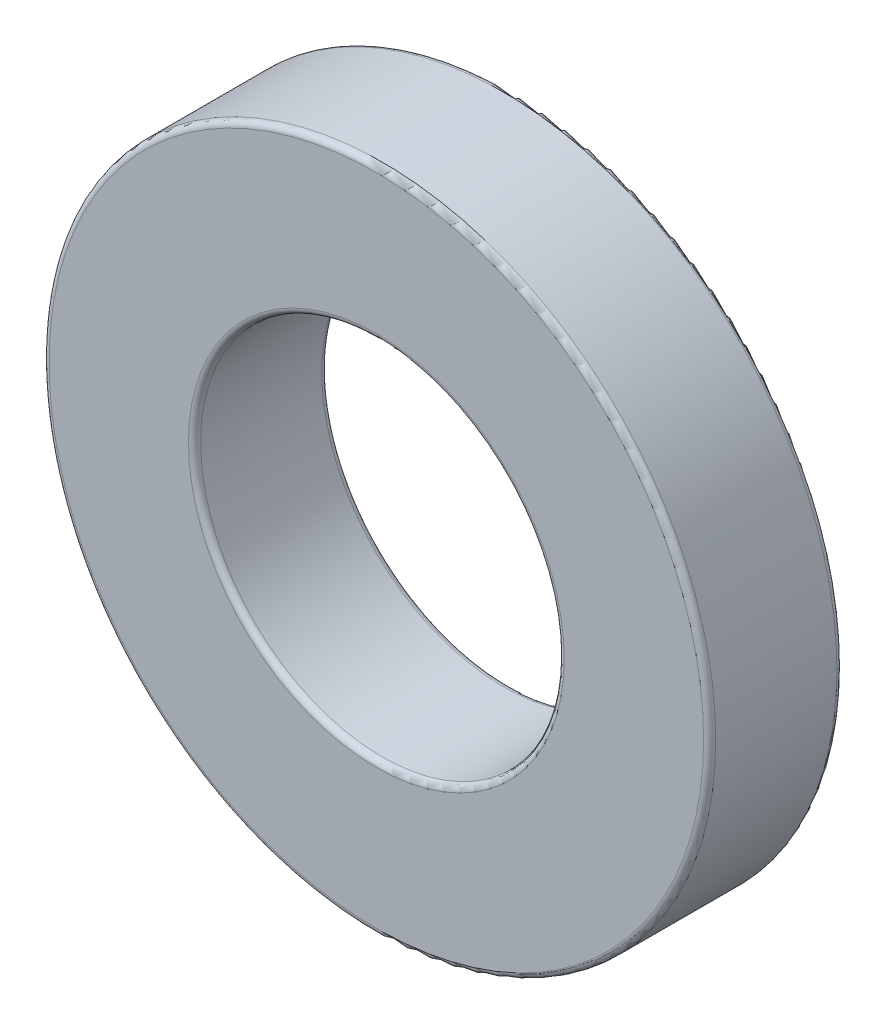
ISO-10303-21;
HEADER;
FILE_DESCRIPTION(('STEP AP214'),'2;1');
FILE_NAME('part.step','',(''),(''),'','','');
FILE_SCHEMA(('AUTOMOTIVE_DESIGN { 1 0 10303 214 1 1 1 1 }'));
ENDSEC;
DATA;
#1=APPLICATION_CONTEXT('core data for automotive mechanical design processes');
#2=APPLICATION_PROTOCOL_DEFINITION('international standard','automotive_design',2000,#1);
#3=PRODUCT_CONTEXT('',#1,'mechanical');
#4=PRODUCT('Part','Part','',(#3));
#5=PRODUCT_RELATED_PRODUCT_CATEGORY('part','',(#4));
#6=PRODUCT_DEFINITION_FORMATION('','',#4);
#7=PRODUCT_DEFINITION_CONTEXT('part definition',#1,'design');
#8=PRODUCT_DEFINITION('design','',#6,#7);
#9=PRODUCT_DEFINITION_SHAPE('','',#8);
#10=(LENGTH_UNIT() NAMED_UNIT(*) SI_UNIT(.MILLI.,.METRE.));
#11=(NAMED_UNIT(*) PLANE_ANGLE_UNIT() SI_UNIT($,.RADIAN.));
#12=(NAMED_UNIT(*) SI_UNIT($,.STERADIAN.) SOLID_ANGLE_UNIT());
#13=UNCERTAINTY_MEASURE_WITH_UNIT(LENGTH_MEASURE(1.E-05),#10,'distance_accuracy_value','');
#14=(GEOMETRIC_REPRESENTATION_CONTEXT(3) GLOBAL_UNCERTAINTY_ASSIGNED_CONTEXT((#13)) GLOBAL_UNIT_ASSIGNED_CONTEXT((#10,
#11,#12)) REPRESENTATION_CONTEXT('',''));
#15=CARTESIAN_POINT('',(0.,0.,0.));
#16=DIRECTION('',(0.,0.,1.));
#17=DIRECTION('',(1.,0.,0.));
#18=AXIS2_PLACEMENT_3D('',#15,#16,#17);
#19=CARTESIAN_POINT('',(0.,0.,22.));
#20=DIRECTION('',(0.,0.,1.));
#21=DIRECTION('',(1.,0.,0.));
#22=AXIS2_PLACEMENT_3D('',#19,#20,#21);
#23=PLANE('',#22);
#24=CARTESIAN_POINT('',(0.,0.,22.));
#25=DIRECTION('',(0.,0.,1.));
#26=DIRECTION('',(1.,0.,0.));
#27=AXIS2_PLACEMENT_3D('',#24,#25,#26);
#28=CIRCLE('',#27,31.);
#29=CARTESIAN_POINT('',(31.,0.,22.));
#30=VERTEX_POINT('',#29);
#31=EDGE_CURVE('E10',#30,#30,#28,.F.);
#32=ORIENTED_EDGE('',*,*,#31,.T.);
#33=EDGE_LOOP('',(#32));
#34=FACE_BOUND('',#33,.T.);
#35=CARTESIAN_POINT('',(0.,0.,22.));
#36=DIRECTION('',(0.,0.,1.));
#37=DIRECTION('',(1.,0.,0.));
#38=AXIS2_PLACEMENT_3D('',#35,#36,#37);
#39=CIRCLE('',#38,54.);
#40=CARTESIAN_POINT('',(54.,0.,22.));
#41=VERTEX_POINT('',#40);
#42=EDGE_CURVE('E37',#41,#41,#39,.T.);
#43=ORIENTED_EDGE('',*,*,#42,.T.);
#44=EDGE_LOOP('',(#43));
#45=FACE_BOUND('',#44,.T.);
#46=ADVANCED_FACE('F30',(#34,#45),#23,.T.);
#47=CARTESIAN_POINT('',(0.,0.,0.));
#48=DIRECTION('',(0.,0.,1.));
#49=DIRECTION('',(1.,0.,0.));
#50=AXIS2_PLACEMENT_3D('',#47,#48,#49);
#51=PLANE('',#50);
#52=CARTESIAN_POINT('',(0.,0.,0.));
#53=DIRECTION('',(0.,0.,1.));
#54=DIRECTION('',(1.,0.,0.));
#55=AXIS2_PLACEMENT_3D('',#52,#53,#54);
#56=CIRCLE('',#55,54.);
#57=CARTESIAN_POINT('',(54.,0.,0.));
#58=VERTEX_POINT('',#57);
#59=EDGE_CURVE('E50',#58,#58,#56,.F.);
#60=ORIENTED_EDGE('',*,*,#59,.T.);
#61=EDGE_LOOP('',(#60));
#62=FACE_BOUND('',#61,.T.);
#63=CARTESIAN_POINT('',(0.,0.,0.));
#64=DIRECTION('',(0.,0.,1.));
#65=DIRECTION('',(1.,0.,0.));
#66=AXIS2_PLACEMENT_3D('',#63,#64,#65);
#67=CIRCLE('',#66,31.);
#68=CARTESIAN_POINT('',(31.,0.,0.));
#69=VERTEX_POINT('',#68);
#70=EDGE_CURVE('E53',#69,#69,#67,.T.);
#71=ORIENTED_EDGE('',*,*,#70,.T.);
#72=EDGE_LOOP('',(#71));
#73=FACE_BOUND('',#72,.T.);
#74=ADVANCED_FACE('F74',(#62,#73),#51,.F.);
#75=CARTESIAN_POINT('',(0.,0.,22.));
#76=DIRECTION('',(0.,0.,-1.));
#77=DIRECTION('',(-1.,0.,0.));
#78=AXIS2_PLACEMENT_3D('',#75,#76,#77);
#79=CYLINDRICAL_SURFACE('',#78,55.);
#80=CARTESIAN_POINT('',(0.,0.,1.));
#81=DIRECTION('',(0.,0.,1.));
#82=DIRECTION('',(1.,0.,0.));
#83=AXIS2_PLACEMENT_3D('',#80,#81,#82);
#84=CIRCLE('',#83,55.);
#85=CARTESIAN_POINT('',(55.,0.,1.));
#86=VERTEX_POINT('',#85);
#87=EDGE_CURVE('E56',#86,#86,#84,.T.);
#88=ORIENTED_EDGE('',*,*,#87,.T.);
#89=EDGE_LOOP('',(#88));
#90=FACE_BOUND('',#89,.T.);
#91=CARTESIAN_POINT('',(0.,0.,21.));
#92=DIRECTION('',(0.,0.,1.));
#93=DIRECTION('',(1.,0.,0.));
#94=AXIS2_PLACEMENT_3D('',#91,#92,#93);
#95=CIRCLE('',#94,55.);
#96=CARTESIAN_POINT('',(55.,0.,21.));
#97=VERTEX_POINT('',#96);
#98=EDGE_CURVE('E59',#97,#97,#95,.F.);
#99=ORIENTED_EDGE('',*,*,#98,.T.);
#100=EDGE_LOOP('',(#99));
#101=FACE_BOUND('',#100,.T.);
#102=ADVANCED_FACE('F63',(#90,#101),#79,.T.);
#103=CARTESIAN_POINT('',(0.,0.,22.));
#104=DIRECTION('',(0.,0.,-1.));
#105=DIRECTION('',(-1.,0.,0.));
#106=AXIS2_PLACEMENT_3D('',#103,#104,#105);
#107=CYLINDRICAL_SURFACE('',#106,30.);
#108=CARTESIAN_POINT('',(0.,0.,1.));
#109=DIRECTION('',(0.,0.,1.));
#110=DIRECTION('',(1.,0.,0.));
#111=AXIS2_PLACEMENT_3D('',#108,#109,#110);
#112=CIRCLE('',#111,30.);
#113=CARTESIAN_POINT('',(30.,0.,1.));
#114=VERTEX_POINT('',#113);
#115=EDGE_CURVE('E41',#114,#114,#112,.F.);
#116=ORIENTED_EDGE('',*,*,#115,.T.);
#117=EDGE_LOOP('',(#116));
#118=FACE_BOUND('',#117,.T.);
#119=CARTESIAN_POINT('',(0.,0.,21.));
#120=DIRECTION('',(0.,0.,1.));
#121=DIRECTION('',(1.,0.,0.));
#122=AXIS2_PLACEMENT_3D('',#119,#120,#121);
#123=CIRCLE('',#122,30.);
#124=CARTESIAN_POINT('',(30.,0.,21.));
#125=VERTEX_POINT('',#124);
#126=EDGE_CURVE('E45',#125,#125,#123,.T.);
#127=ORIENTED_EDGE('',*,*,#126,.T.);
#128=EDGE_LOOP('',(#127));
#129=FACE_BOUND('',#128,.T.);
#130=ADVANCED_FACE('F82',(#118,#129),#107,.F.);
#131=CARTESIAN_POINT('',(0.,0.,1.));
#132=DIRECTION('',(0.,0.,1.));
#133=DIRECTION('',(1.,0.,0.));
#134=AXIS2_PLACEMENT_3D('',#131,#132,#133);
#135=TOROIDAL_SURFACE('',#134,54.,1.);
#136=ORIENTED_EDGE('',*,*,#59,.F.);
#137=EDGE_LOOP('',(#136));
#138=FACE_BOUND('',#137,.T.);
#139=ORIENTED_EDGE('',*,*,#87,.F.);
#140=EDGE_LOOP('',(#139));
#141=FACE_BOUND('',#140,.T.);
#142=ADVANCED_FACE('F87',(#138,#141),#135,.T.);
#143=CARTESIAN_POINT('',(0.,0.,1.));
#144=DIRECTION('',(0.,0.,1.));
#145=DIRECTION('',(1.,0.,0.));
#146=AXIS2_PLACEMENT_3D('',#143,#144,#145);
#147=TOROIDAL_SURFACE('',#146,31.,1.);
#148=ORIENTED_EDGE('',*,*,#115,.F.);
#149=EDGE_LOOP('',(#148));
#150=FACE_BOUND('',#149,.T.);
#151=ORIENTED_EDGE('',*,*,#70,.F.);
#152=EDGE_LOOP('',(#151));
#153=FACE_BOUND('',#152,.T.);
#154=ADVANCED_FACE('F71',(#150,#153),#147,.T.);
#155=CARTESIAN_POINT('',(0.,0.,21.));
#156=DIRECTION('',(0.,0.,1.));
#157=DIRECTION('',(1.,0.,0.));
#158=AXIS2_PLACEMENT_3D('',#155,#156,#157);
#159=TOROIDAL_SURFACE('',#158,31.,1.);
#160=ORIENTED_EDGE('',*,*,#31,.F.);
#161=EDGE_LOOP('',(#160));
#162=FACE_BOUND('',#161,.T.);
#163=ORIENTED_EDGE('',*,*,#126,.F.);
#164=EDGE_LOOP('',(#163));
#165=FACE_BOUND('',#164,.T.);
#166=ADVANCED_FACE('F67',(#162,#165),#159,.T.);
#167=CARTESIAN_POINT('',(0.,0.,21.));
#168=DIRECTION('',(0.,0.,1.));
#169=DIRECTION('',(1.,0.,0.));
#170=AXIS2_PLACEMENT_3D('',#167,#168,#169);
#171=TOROIDAL_SURFACE('',#170,54.,1.);
#172=ORIENTED_EDGE('',*,*,#98,.F.);
#173=EDGE_LOOP('',(#172));
#174=FACE_BOUND('',#173,.T.);
#175=ORIENTED_EDGE('',*,*,#42,.F.);
#176=EDGE_LOOP('',(#175));
#177=FACE_BOUND('',#176,.T.);
#178=ADVANCED_FACE('F32',(#174,#177),#171,.T.);
#179=CLOSED_SHELL('',(#46,#74,#102,#130,#142,#154,#166,#178));
#180=MANIFOLD_SOLID_BREP('B2',#179);
#181=ADVANCED_BREP_SHAPE_REPRESENTATION('',(#18,#180),#14);
#182=SHAPE_DEFINITION_REPRESENTATION(#9,#181);
ENDSEC;
END-ISO-10303-21;
